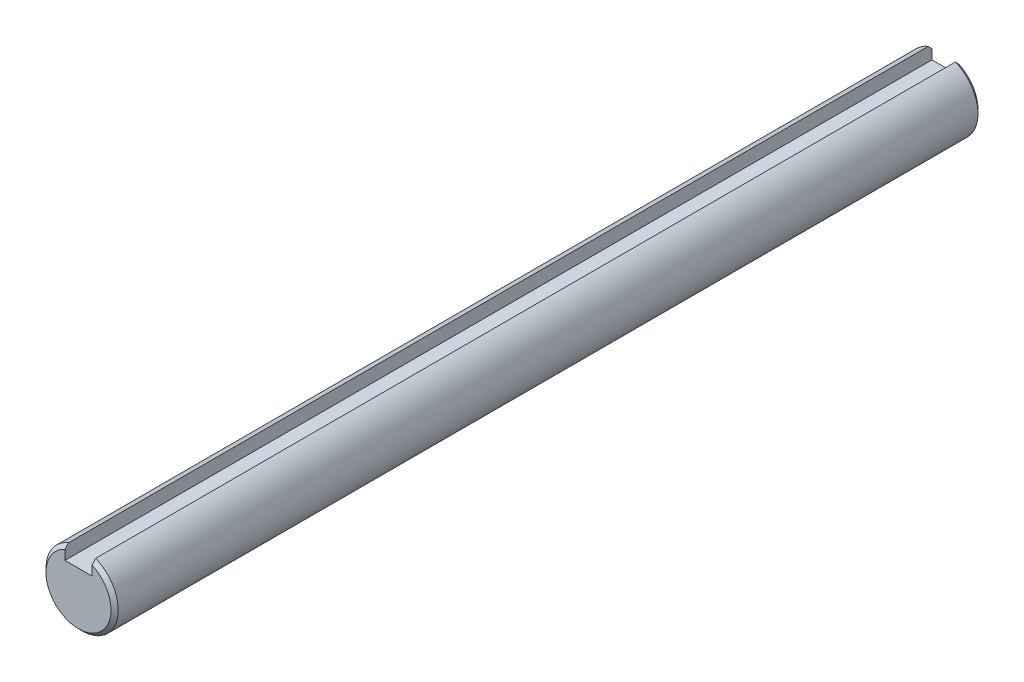
ISO-10303-21;
HEADER;
FILE_DESCRIPTION(('STEP AP214'),'2;1');
FILE_NAME('part.step','',(''),(''),'','','');
FILE_SCHEMA(('AUTOMOTIVE_DESIGN { 1 0 10303 214 1 1 1 1 }'));
ENDSEC;
DATA;
#1=APPLICATION_CONTEXT('core data for automotive mechanical design processes');
#2=APPLICATION_PROTOCOL_DEFINITION('international standard','automotive_design',2000,#1);
#3=PRODUCT_CONTEXT('',#1,'mechanical');
#4=PRODUCT('Part','Part','',(#3));
#5=PRODUCT_RELATED_PRODUCT_CATEGORY('part','',(#4));
#6=PRODUCT_DEFINITION_FORMATION('','',#4);
#7=PRODUCT_DEFINITION_CONTEXT('part definition',#1,'design');
#8=PRODUCT_DEFINITION('design','',#6,#7);
#9=PRODUCT_DEFINITION_SHAPE('','',#8);
#10=(LENGTH_UNIT() NAMED_UNIT(*) SI_UNIT(.MILLI.,.METRE.));
#11=(NAMED_UNIT(*) PLANE_ANGLE_UNIT() SI_UNIT($,.RADIAN.));
#12=(NAMED_UNIT(*) SI_UNIT($,.STERADIAN.) SOLID_ANGLE_UNIT());
#13=UNCERTAINTY_MEASURE_WITH_UNIT(LENGTH_MEASURE(1.E-05),#10,'distance_accuracy_value','');
#14=(GEOMETRIC_REPRESENTATION_CONTEXT(3) GLOBAL_UNCERTAINTY_ASSIGNED_CONTEXT((#13)) GLOBAL_UNIT_ASSIGNED_CONTEXT((#10,
#11,#12)) REPRESENTATION_CONTEXT('',''));
#15=CARTESIAN_POINT('',(0.,0.,0.));
#16=DIRECTION('',(0.,0.,1.));
#17=DIRECTION('',(1.,0.,0.));
#18=AXIS2_PLACEMENT_3D('',#15,#16,#17);
#19=CARTESIAN_POINT('',(0.,0.,38.1));
#20=DIRECTION('',(0.,0.,-1.));
#21=DIRECTION('',(-1.,0.,0.));
#22=AXIS2_PLACEMENT_3D('',#19,#20,#21);
#23=CYLINDRICAL_SURFACE('',#22,3.175);
#24=DIRECTION('',(0.,0.,-1.));
#25=VECTOR('',#24,1.);
#26=CARTESIAN_POINT('',(-1.190625,2.94330377456609,38.1));
#27=LINE('',#26,#25);
#28=CARTESIAN_POINT('',(-1.190625,2.94330377456609,37.7825));
#29=VERTEX_POINT('',#28);
#30=CARTESIAN_POINT('',(-1.190625,2.94330377456609,-37.7824999999999));
#31=VERTEX_POINT('',#30);
#32=EDGE_CURVE('E133',#29,#31,#27,.T.);
#33=ORIENTED_EDGE('',*,*,#32,.T.);
#34=CARTESIAN_POINT('',(0.,0.,-37.7824999999999));
#35=DIRECTION('',(0.,0.,1.));
#36=DIRECTION('',(1.,0.,0.));
#37=AXIS2_PLACEMENT_3D('',#34,#35,#36);
#38=CIRCLE('',#37,3.175);
#39=CARTESIAN_POINT('',(1.190625,2.94330377456609,-37.7824999999999));
#40=VERTEX_POINT('',#39);
#41=EDGE_CURVE('E148',#31,#40,#38,.T.);
#42=ORIENTED_EDGE('',*,*,#41,.T.);
#43=DIRECTION('',(0.,0.,-1.));
#44=VECTOR('',#43,1.);
#45=CARTESIAN_POINT('',(1.190625,2.94330377456609,38.1));
#46=LINE('',#45,#44);
#47=CARTESIAN_POINT('',(1.190625,2.94330377456609,37.7825));
#48=VERTEX_POINT('',#47);
#49=EDGE_CURVE('E138',#40,#48,#46,.F.);
#50=ORIENTED_EDGE('',*,*,#49,.T.);
#51=CARTESIAN_POINT('',(0.,0.,37.7825));
#52=DIRECTION('',(0.,0.,1.));
#53=DIRECTION('',(1.,0.,0.));
#54=AXIS2_PLACEMENT_3D('',#51,#52,#53);
#55=CIRCLE('',#54,3.175);
#56=EDGE_CURVE('E145',#48,#29,#55,.F.);
#57=ORIENTED_EDGE('',*,*,#56,.T.);
#58=EDGE_LOOP('',(#33,#42,#50,#57));
#59=FACE_BOUND('',#58,.T.);
#60=ADVANCED_FACE('F43',(#59),#23,.T.);
#61=CARTESIAN_POINT('',(0.,0.,38.1));
#62=DIRECTION('',(0.,0.,1.));
#63=DIRECTION('',(1.,0.,0.));
#64=AXIS2_PLACEMENT_3D('',#61,#62,#63);
#65=PLANE('',#64);
#66=DIRECTION('',(0.,-1.,0.));
#67=VECTOR('',#66,1.);
#68=CARTESIAN_POINT('',(-1.190625,3.175,38.1));
#69=LINE('',#68,#67);
#70=CARTESIAN_POINT('',(-1.190625,2.59763707229768,38.1));
#71=VERTEX_POINT('',#70);
#72=CARTESIAN_POINT('',(-1.190625,1.75267877456609,38.1));
#73=VERTEX_POINT('',#72);
#74=EDGE_CURVE('E98',#71,#73,#69,.T.);
#75=ORIENTED_EDGE('',*,*,#74,.F.);
#76=CARTESIAN_POINT('',(0.,0.,38.1));
#77=DIRECTION('',(0.,0.,1.));
#78=DIRECTION('',(1.,0.,0.));
#79=AXIS2_PLACEMENT_3D('',#76,#77,#78);
#80=CIRCLE('',#79,2.85750000000005);
#81=CARTESIAN_POINT('',(1.190625,2.59763707229768,38.1));
#82=VERTEX_POINT('',#81);
#83=EDGE_CURVE('E11',#71,#82,#80,.T.);
#84=ORIENTED_EDGE('',*,*,#83,.T.);
#85=DIRECTION('',(0.,1.,0.));
#86=VECTOR('',#85,1.);
#87=CARTESIAN_POINT('',(1.190625,3.175,38.1));
#88=LINE('',#87,#86);
#89=CARTESIAN_POINT('',(1.190625,1.75267877456609,38.1));
#90=VERTEX_POINT('',#89);
#91=EDGE_CURVE('E121',#90,#82,#88,.T.);
#92=ORIENTED_EDGE('',*,*,#91,.F.);
#93=DIRECTION('',(1.,0.,0.));
#94=VECTOR('',#93,1.);
#95=CARTESIAN_POINT('',(-1.190625,1.75267877456609,38.1));
#96=LINE('',#95,#94);
#97=EDGE_CURVE('E106',#73,#90,#96,.T.);
#98=ORIENTED_EDGE('',*,*,#97,.F.);
#99=EDGE_LOOP('',(#75,#84,#92,#98));
#100=FACE_BOUND('',#99,.T.);
#101=ADVANCED_FACE('F119',(#100),#65,.T.);
#102=CARTESIAN_POINT('',(0.,0.,-38.1));
#103=DIRECTION('',(0.,0.,1.));
#104=DIRECTION('',(1.,0.,0.));
#105=AXIS2_PLACEMENT_3D('',#102,#103,#104);
#106=PLANE('',#105);
#107=DIRECTION('',(0.,1.,0.));
#108=VECTOR('',#107,1.);
#109=CARTESIAN_POINT('',(1.190625,3.175,-38.1));
#110=LINE('',#109,#108);
#111=CARTESIAN_POINT('',(1.190625,1.75267877456609,-38.1));
#112=VERTEX_POINT('',#111);
#113=CARTESIAN_POINT('',(1.190625,2.59763707229754,-38.1));
#114=VERTEX_POINT('',#113);
#115=EDGE_CURVE('E117',#112,#114,#110,.T.);
#116=ORIENTED_EDGE('',*,*,#115,.T.);
#117=CARTESIAN_POINT('',(0.,0.,-38.1));
#118=DIRECTION('',(0.,0.,1.));
#119=DIRECTION('',(1.,0.,0.));
#120=AXIS2_PLACEMENT_3D('',#117,#118,#119);
#121=CIRCLE('',#120,2.85749999999992);
#122=CARTESIAN_POINT('',(-1.190625,2.59763707229754,-38.1));
#123=VERTEX_POINT('',#122);
#124=EDGE_CURVE('E68',#114,#123,#121,.F.);
#125=ORIENTED_EDGE('',*,*,#124,.T.);
#126=DIRECTION('',(0.,-1.,0.));
#127=VECTOR('',#126,1.);
#128=CARTESIAN_POINT('',(-1.190625,0.,-38.1));
#129=LINE('',#128,#127);
#130=CARTESIAN_POINT('',(-1.190625,1.75267877456609,-38.1));
#131=VERTEX_POINT('',#130);
#132=EDGE_CURVE('E142',#123,#131,#129,.T.);
#133=ORIENTED_EDGE('',*,*,#132,.T.);
#134=DIRECTION('',(1.,0.,0.));
#135=VECTOR('',#134,1.);
#136=CARTESIAN_POINT('',(-1.190625,1.75267877456609,-38.1));
#137=LINE('',#136,#135);
#138=EDGE_CURVE('E114',#131,#112,#137,.T.);
#139=ORIENTED_EDGE('',*,*,#138,.T.);
#140=EDGE_LOOP('',(#116,#125,#133,#139));
#141=FACE_BOUND('',#140,.T.);
#142=ADVANCED_FACE('F170',(#141),#106,.F.);
#143=CARTESIAN_POINT('',(1.190625,3.175,-38.1));
#144=DIRECTION('',(1.,0.,0.));
#145=DIRECTION('',(0.,0.,-1.));
#146=AXIS2_PLACEMENT_3D('',#143,#144,#145);
#147=PLANE('',#146);
#148=ORIENTED_EDGE('',*,*,#49,.F.);
#149=CARTESIAN_POINT('',(1.190625,2.94330377456609,-37.7824999999999));
#150=CARTESIAN_POINT('',(1.190625,2.88594978346213,-37.8356965673544));
#151=CARTESIAN_POINT('',(1.190625,2.82846723837765,-37.8887531761878));
#152=CARTESIAN_POINT('',(1.190625,2.7132450044479,-37.9945865096951));
#153=CARTESIAN_POINT('',(1.190625,2.65550531544286,-38.0473632341951));
#154=CARTESIAN_POINT('',(1.190625,2.59763707229755,-38.1));
#155=B_SPLINE_CURVE_WITH_KNOTS('',3,(#149,#150,#151,#152,#153,#154),.UNSPECIFIED.,.F.,.F.,(4,2,
4),(0.,0.234676842855477,0.469353831540093),.UNSPECIFIED.);
#156=EDGE_CURVE('E160',#40,#114,#155,.T.);
#157=ORIENTED_EDGE('',*,*,#156,.T.);
#158=ORIENTED_EDGE('',*,*,#115,.F.);
#159=DIRECTION('',(0.,0.,1.));
#160=VECTOR('',#159,1.);
#161=CARTESIAN_POINT('',(1.190625,1.75267877456609,-38.1));
#162=LINE('',#161,#160);
#163=EDGE_CURVE('E116',#112,#90,#162,.T.);
#164=ORIENTED_EDGE('',*,*,#163,.T.);
#165=ORIENTED_EDGE('',*,*,#91,.T.);
#166=CARTESIAN_POINT('',(1.190625,2.59763707229768,38.1));
#167=CARTESIAN_POINT('',(1.190625,2.65550531544298,38.0473632341951));
#168=CARTESIAN_POINT('',(1.190625,2.71324500444799,37.9945865096952));
#169=CARTESIAN_POINT('',(1.190625,2.82846723837769,37.8887531761879));
#170=CARTESIAN_POINT('',(1.190625,2.88594978346215,37.8356965673545));
#171=CARTESIAN_POINT('',(1.190625,2.94330377456609,37.7825));
#172=B_SPLINE_CURVE_WITH_KNOTS('',3,(#166,#167,#168,#169,#170,#171),.UNSPECIFIED.,.F.,.F.,(4,2,
4),(0.,0.234676988684524,0.469353831539909),.UNSPECIFIED.);
#173=EDGE_CURVE('E152',#82,#48,#172,.T.);
#174=ORIENTED_EDGE('',*,*,#173,.T.);
#175=EDGE_LOOP('',(#148,#157,#158,#164,#165,#174));
#176=FACE_BOUND('',#175,.T.);
#177=ADVANCED_FACE('F166',(#176),#147,.F.);
#178=CARTESIAN_POINT('',(-1.190625,3.175,-38.1));
#179=DIRECTION('',(-1.,0.,0.));
#180=DIRECTION('',(0.,-1.,0.));
#181=AXIS2_PLACEMENT_3D('',#178,#179,#180);
#182=PLANE('',#181);
#183=ORIENTED_EDGE('',*,*,#132,.F.);
#184=CARTESIAN_POINT('',(-1.190625,2.59763707229754,-38.1));
#185=CARTESIAN_POINT('',(-1.190625,2.65550531544286,-38.0473632341951));
#186=CARTESIAN_POINT('',(-1.190625,2.7132450044479,-37.9945865096951));
#187=CARTESIAN_POINT('',(-1.190625,2.82846723837765,-37.8887531761878));
#188=CARTESIAN_POINT('',(-1.190625,2.88594978346213,-37.8356965673544));
#189=CARTESIAN_POINT('',(-1.190625,2.94330377456609,-37.7824999999999));
#190=B_SPLINE_CURVE_WITH_KNOTS('',3,(#184,#185,#186,#187,#188,#189),.UNSPECIFIED.,.F.,.F.,(4,2,
4),(0.,0.234676988684617,0.469353831540095),.UNSPECIFIED.);
#191=EDGE_CURVE('E53',#123,#31,#190,.T.);
#192=ORIENTED_EDGE('',*,*,#191,.T.);
#193=ORIENTED_EDGE('',*,*,#32,.F.);
#194=CARTESIAN_POINT('',(-1.190625,2.94330377456609,37.7825));
#195=CARTESIAN_POINT('',(-1.190625,2.88594978346215,37.8356965673545));
#196=CARTESIAN_POINT('',(-1.190625,2.82846723837769,37.8887531761879));
#197=CARTESIAN_POINT('',(-1.190625,2.71324500444799,37.9945865096952));
#198=CARTESIAN_POINT('',(-1.190625,2.65550531544298,38.0473632341951));
#199=CARTESIAN_POINT('',(-1.190625,2.59763707229768,38.1));
#200=B_SPLINE_CURVE_WITH_KNOTS('',3,(#194,#195,#196,#197,#198,#199),.UNSPECIFIED.,.F.,.F.,(4,2,
4),(0.,0.234676842855385,0.469353831539907),.UNSPECIFIED.);
#201=EDGE_CURVE('E60',#29,#71,#200,.T.);
#202=ORIENTED_EDGE('',*,*,#201,.T.);
#203=ORIENTED_EDGE('',*,*,#74,.T.);
#204=DIRECTION('',(0.,0.,1.));
#205=VECTOR('',#204,1.);
#206=CARTESIAN_POINT('',(-1.190625,1.75267877456609,-38.1));
#207=LINE('',#206,#205);
#208=EDGE_CURVE('E101',#131,#73,#207,.T.);
#209=ORIENTED_EDGE('',*,*,#208,.F.);
#210=EDGE_LOOP('',(#183,#192,#193,#202,#203,#209));
#211=FACE_BOUND('',#210,.T.);
#212=ADVANCED_FACE('F100',(#211),#182,.F.);
#213=CARTESIAN_POINT('',(-1.190625,1.75267877456609,-38.1));
#214=DIRECTION('',(0.,-1.,0.));
#215=DIRECTION('',(0.,0.,-1.));
#216=AXIS2_PLACEMENT_3D('',#213,#214,#215);
#217=PLANE('',#216);
#218=ORIENTED_EDGE('',*,*,#163,.F.);
#219=ORIENTED_EDGE('',*,*,#138,.F.);
#220=ORIENTED_EDGE('',*,*,#208,.T.);
#221=ORIENTED_EDGE('',*,*,#97,.T.);
#222=EDGE_LOOP('',(#218,#219,#220,#221));
#223=FACE_BOUND('',#222,.T.);
#224=ADVANCED_FACE('F111',(#223),#217,.F.);
#225=CARTESIAN_POINT('',(0.,0.,-37.7824999999999));
#226=DIRECTION('',(0.,0.,1.));
#227=DIRECTION('',(1.,0.,0.));
#228=AXIS2_PLACEMENT_3D('',#225,#226,#227);
#229=CONICAL_SURFACE('',#228,3.175,0.785398163397442);
#230=ORIENTED_EDGE('',*,*,#191,.F.);
#231=ORIENTED_EDGE('',*,*,#124,.F.);
#232=ORIENTED_EDGE('',*,*,#156,.F.);
#233=ORIENTED_EDGE('',*,*,#41,.F.);
#234=EDGE_LOOP('',(#230,#231,#232,#233));
#235=FACE_BOUND('',#234,.T.);
#236=ADVANCED_FACE('F175',(#235),#229,.T.);
#237=CARTESIAN_POINT('',(0.,0.,38.1));
#238=DIRECTION('',(0.,0.,-1.));
#239=DIRECTION('',(-1.,0.,0.));
#240=AXIS2_PLACEMENT_3D('',#237,#238,#239);
#241=CONICAL_SURFACE('',#240,2.85750000000005,0.785398163397442);
#242=ORIENTED_EDGE('',*,*,#201,.F.);
#243=ORIENTED_EDGE('',*,*,#56,.F.);
#244=ORIENTED_EDGE('',*,*,#173,.F.);
#245=ORIENTED_EDGE('',*,*,#83,.F.);
#246=EDGE_LOOP('',(#242,#243,#244,#245));
#247=FACE_BOUND('',#246,.T.);
#248=ADVANCED_FACE('F45',(#247),#241,.T.);
#249=CLOSED_SHELL('',(#60,#101,#142,#177,#212,#224,#236,#248));
#250=MANIFOLD_SOLID_BREP('B2',#249);
#251=ADVANCED_BREP_SHAPE_REPRESENTATION('',(#18,#250),#14);
#252=SHAPE_DEFINITION_REPRESENTATION(#9,#251);
ENDSEC;
END-ISO-10303-21;
